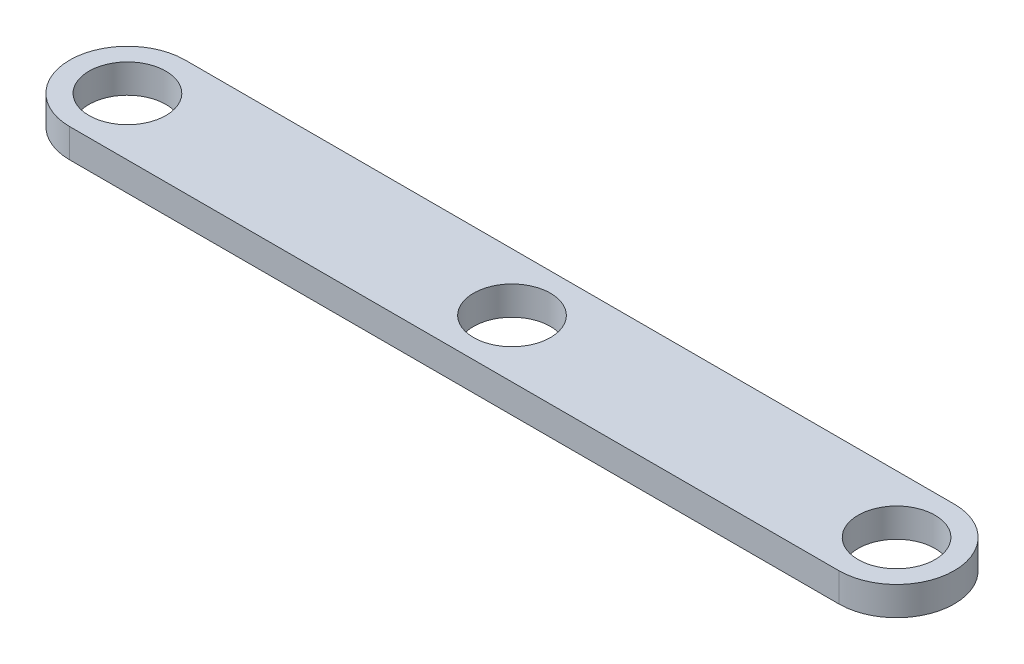
ISO-10303-21;
HEADER;
FILE_DESCRIPTION(('STEP AP214'),'2;1');
FILE_NAME('part.step','',(''),(''),'','','');
FILE_SCHEMA(('AUTOMOTIVE_DESIGN { 1 0 10303 214 1 1 1 1 }'));
ENDSEC;
DATA;
#1=APPLICATION_CONTEXT('core data for automotive mechanical design processes');
#2=APPLICATION_PROTOCOL_DEFINITION('international standard','automotive_design',2000,#1);
#3=PRODUCT_CONTEXT('',#1,'mechanical');
#4=PRODUCT('Part','Part','',(#3));
#5=PRODUCT_RELATED_PRODUCT_CATEGORY('part','',(#4));
#6=PRODUCT_DEFINITION_FORMATION('','',#4);
#7=PRODUCT_DEFINITION_CONTEXT('part definition',#1,'design');
#8=PRODUCT_DEFINITION('design','',#6,#7);
#9=PRODUCT_DEFINITION_SHAPE('','',#8);
#10=(LENGTH_UNIT() NAMED_UNIT(*) SI_UNIT(.MILLI.,.METRE.));
#11=(NAMED_UNIT(*) PLANE_ANGLE_UNIT() SI_UNIT($,.RADIAN.));
#12=(NAMED_UNIT(*) SI_UNIT($,.STERADIAN.) SOLID_ANGLE_UNIT());
#13=UNCERTAINTY_MEASURE_WITH_UNIT(LENGTH_MEASURE(1.E-05),#10,'distance_accuracy_value','');
#14=(GEOMETRIC_REPRESENTATION_CONTEXT(3) GLOBAL_UNCERTAINTY_ASSIGNED_CONTEXT((#13)) GLOBAL_UNIT_ASSIGNED_CONTEXT((#10,
#11,#12)) REPRESENTATION_CONTEXT('',''));
#15=CARTESIAN_POINT('',(0.,0.,0.));
#16=DIRECTION('',(0.,0.,1.));
#17=DIRECTION('',(1.,0.,0.));
#18=AXIS2_PLACEMENT_3D('',#15,#16,#17);
#19=CARTESIAN_POINT('',(0.,3.,0.));
#20=DIRECTION('',(0.,1.,0.));
#21=DIRECTION('',(0.,0.,1.));
#22=AXIS2_PLACEMENT_3D('',#19,#20,#21);
#23=PLANE('',#22);
#24=CARTESIAN_POINT('',(40.,3.,0.));
#25=DIRECTION('',(0.,1.,0.));
#26=DIRECTION('',(0.,0.,1.));
#27=AXIS2_PLACEMENT_3D('',#24,#25,#26);
#28=CIRCLE('',#27,4.);
#29=CARTESIAN_POINT('',(40.,3.,4.));
#30=VERTEX_POINT('',#29);
#31=EDGE_CURVE('E124',#30,#30,#28,.T.);
#32=ORIENTED_EDGE('',*,*,#31,.F.);
#33=EDGE_LOOP('',(#32));
#34=FACE_BOUND('',#33,.T.);
#35=CARTESIAN_POINT('',(0.,3.,0.));
#36=DIRECTION('',(0.,1.,0.));
#37=DIRECTION('',(0.,0.,1.));
#38=AXIS2_PLACEMENT_3D('',#35,#36,#37);
#39=CIRCLE('',#38,4.);
#40=CARTESIAN_POINT('',(0.,3.,4.));
#41=VERTEX_POINT('',#40);
#42=EDGE_CURVE('E100',#41,#41,#39,.T.);
#43=ORIENTED_EDGE('',*,*,#42,.F.);
#44=EDGE_LOOP('',(#43));
#45=FACE_BOUND('',#44,.T.);
#46=CARTESIAN_POINT('',(0.,3.,0.));
#47=DIRECTION('',(0.,1.,0.));
#48=DIRECTION('',(0.,0.,1.));
#49=AXIS2_PLACEMENT_3D('',#46,#47,#48);
#50=CIRCLE('',#49,6.);
#51=CARTESIAN_POINT('',(0.,3.,-6.));
#52=VERTEX_POINT('',#51);
#53=CARTESIAN_POINT('',(0.,3.,6.));
#54=VERTEX_POINT('',#53);
#55=EDGE_CURVE('E85',#52,#54,#50,.T.);
#56=ORIENTED_EDGE('',*,*,#55,.T.);
#57=DIRECTION('',(1.,0.,0.));
#58=VECTOR('',#57,1.);
#59=CARTESIAN_POINT('',(0.,3.,6.));
#60=LINE('',#59,#58);
#61=CARTESIAN_POINT('',(80.,3.,6.00000000000001));
#62=VERTEX_POINT('',#61);
#63=EDGE_CURVE('E80',#54,#62,#60,.T.);
#64=ORIENTED_EDGE('',*,*,#63,.T.);
#65=CARTESIAN_POINT('',(80.,3.,0.));
#66=DIRECTION('',(0.,1.,0.));
#67=DIRECTION('',(0.,0.,1.));
#68=AXIS2_PLACEMENT_3D('',#65,#66,#67);
#69=CIRCLE('',#68,6.00000000000001);
#70=CARTESIAN_POINT('',(80.,3.,-6.00000000000001));
#71=VERTEX_POINT('',#70);
#72=EDGE_CURVE('E83',#62,#71,#69,.T.);
#73=ORIENTED_EDGE('',*,*,#72,.T.);
#74=DIRECTION('',(-1.,0.,0.));
#75=VECTOR('',#74,1.);
#76=CARTESIAN_POINT('',(0.,3.,-6.));
#77=LINE('',#76,#75);
#78=EDGE_CURVE('E50',#71,#52,#77,.T.);
#79=ORIENTED_EDGE('',*,*,#78,.T.);
#80=EDGE_LOOP('',(#56,#64,#73,#79));
#81=FACE_BOUND('',#80,.T.);
#82=CARTESIAN_POINT('',(80.,3.,0.));
#83=DIRECTION('',(0.,1.,0.));
#84=DIRECTION('',(0.,0.,1.));
#85=AXIS2_PLACEMENT_3D('',#82,#83,#84);
#86=CIRCLE('',#85,4.00000000000001);
#87=CARTESIAN_POINT('',(80.,3.,4.00000000000001));
#88=VERTEX_POINT('',#87);
#89=EDGE_CURVE('E115',#88,#88,#86,.T.);
#90=ORIENTED_EDGE('',*,*,#89,.F.);
#91=EDGE_LOOP('',(#90));
#92=FACE_BOUND('',#91,.T.);
#93=ADVANCED_FACE('F33',(#34,#45,#81,#92),#23,.T.);
#94=CARTESIAN_POINT('',(0.,0.,0.));
#95=DIRECTION('',(0.,1.,0.));
#96=DIRECTION('',(0.,0.,1.));
#97=AXIS2_PLACEMENT_3D('',#94,#95,#96);
#98=PLANE('',#97);
#99=CARTESIAN_POINT('',(40.,0.,0.));
#100=DIRECTION('',(0.,1.,0.));
#101=DIRECTION('',(0.,0.,1.));
#102=AXIS2_PLACEMENT_3D('',#99,#100,#101);
#103=CIRCLE('',#102,4.);
#104=CARTESIAN_POINT('',(40.,0.,4.));
#105=VERTEX_POINT('',#104);
#106=EDGE_CURVE('E121',#105,#105,#103,.T.);
#107=ORIENTED_EDGE('',*,*,#106,.T.);
#108=EDGE_LOOP('',(#107));
#109=FACE_BOUND('',#108,.T.);
#110=CARTESIAN_POINT('',(0.,0.,0.));
#111=DIRECTION('',(0.,1.,0.));
#112=DIRECTION('',(0.,0.,1.));
#113=AXIS2_PLACEMENT_3D('',#110,#111,#112);
#114=CIRCLE('',#113,6.);
#115=CARTESIAN_POINT('',(0.,0.,-6.));
#116=VERTEX_POINT('',#115);
#117=CARTESIAN_POINT('',(0.,0.,6.));
#118=VERTEX_POINT('',#117);
#119=EDGE_CURVE('E97',#116,#118,#114,.T.);
#120=ORIENTED_EDGE('',*,*,#119,.F.);
#121=DIRECTION('',(-1.,0.,0.));
#122=VECTOR('',#121,1.);
#123=CARTESIAN_POINT('',(0.,0.,-6.));
#124=LINE('',#123,#122);
#125=CARTESIAN_POINT('',(80.,0.,-6.00000000000001));
#126=VERTEX_POINT('',#125);
#127=EDGE_CURVE('E73',#126,#116,#124,.T.);
#128=ORIENTED_EDGE('',*,*,#127,.F.);
#129=CARTESIAN_POINT('',(80.,0.,0.));
#130=DIRECTION('',(0.,1.,0.));
#131=DIRECTION('',(0.,0.,1.));
#132=AXIS2_PLACEMENT_3D('',#129,#130,#131);
#133=CIRCLE('',#132,6.00000000000001);
#134=CARTESIAN_POINT('',(80.,0.,6.00000000000001));
#135=VERTEX_POINT('',#134);
#136=EDGE_CURVE('E67',#135,#126,#133,.T.);
#137=ORIENTED_EDGE('',*,*,#136,.F.);
#138=DIRECTION('',(1.,0.,0.));
#139=VECTOR('',#138,1.);
#140=CARTESIAN_POINT('',(0.,0.,6.));
#141=LINE('',#140,#139);
#142=EDGE_CURVE('E89',#118,#135,#141,.T.);
#143=ORIENTED_EDGE('',*,*,#142,.F.);
#144=EDGE_LOOP('',(#120,#128,#137,#143));
#145=FACE_BOUND('',#144,.T.);
#146=CARTESIAN_POINT('',(0.,0.,0.));
#147=DIRECTION('',(0.,1.,0.));
#148=DIRECTION('',(0.,0.,1.));
#149=AXIS2_PLACEMENT_3D('',#146,#147,#148);
#150=CIRCLE('',#149,4.);
#151=CARTESIAN_POINT('',(0.,0.,4.));
#152=VERTEX_POINT('',#151);
#153=EDGE_CURVE('E112',#152,#152,#150,.T.);
#154=ORIENTED_EDGE('',*,*,#153,.T.);
#155=EDGE_LOOP('',(#154));
#156=FACE_BOUND('',#155,.T.);
#157=CARTESIAN_POINT('',(80.,0.,0.));
#158=DIRECTION('',(0.,1.,0.));
#159=DIRECTION('',(0.,0.,1.));
#160=AXIS2_PLACEMENT_3D('',#157,#158,#159);
#161=CIRCLE('',#160,4.00000000000001);
#162=CARTESIAN_POINT('',(80.,0.,4.00000000000001));
#163=VERTEX_POINT('',#162);
#164=EDGE_CURVE('E118',#163,#163,#161,.T.);
#165=ORIENTED_EDGE('',*,*,#164,.T.);
#166=EDGE_LOOP('',(#165));
#167=FACE_BOUND('',#166,.T.);
#168=ADVANCED_FACE('F108',(#109,#145,#156,#167),#98,.F.);
#169=CARTESIAN_POINT('',(0.,3.,0.));
#170=DIRECTION('',(0.,-1.,0.));
#171=DIRECTION('',(0.,0.,-1.));
#172=AXIS2_PLACEMENT_3D('',#169,#170,#171);
#173=CYLINDRICAL_SURFACE('',#172,6.);
#174=ORIENTED_EDGE('',*,*,#119,.T.);
#175=DIRECTION('',(0.,-1.,0.));
#176=VECTOR('',#175,1.);
#177=CARTESIAN_POINT('',(0.,3.,6.));
#178=LINE('',#177,#176);
#179=EDGE_CURVE('E11',#54,#118,#178,.T.);
#180=ORIENTED_EDGE('',*,*,#179,.F.);
#181=ORIENTED_EDGE('',*,*,#55,.F.);
#182=DIRECTION('',(0.,-1.,0.));
#183=VECTOR('',#182,1.);
#184=CARTESIAN_POINT('',(0.,3.,-6.));
#185=LINE('',#184,#183);
#186=EDGE_CURVE('E93',#52,#116,#185,.T.);
#187=ORIENTED_EDGE('',*,*,#186,.T.);
#188=EDGE_LOOP('',(#174,#180,#181,#187));
#189=FACE_BOUND('',#188,.T.);
#190=ADVANCED_FACE('F35',(#189),#173,.T.);
#191=CARTESIAN_POINT('',(0.,3.,6.));
#192=DIRECTION('',(0.,0.,-1.));
#193=DIRECTION('',(-1.,0.,0.));
#194=AXIS2_PLACEMENT_3D('',#191,#192,#193);
#195=PLANE('',#194);
#196=ORIENTED_EDGE('',*,*,#142,.T.);
#197=DIRECTION('',(0.,-1.,0.));
#198=VECTOR('',#197,1.);
#199=CARTESIAN_POINT('',(80.,3.,6.00000000000001));
#200=LINE('',#199,#198);
#201=EDGE_CURVE('E42',#62,#135,#200,.T.);
#202=ORIENTED_EDGE('',*,*,#201,.F.);
#203=ORIENTED_EDGE('',*,*,#63,.F.);
#204=ORIENTED_EDGE('',*,*,#179,.T.);
#205=EDGE_LOOP('',(#196,#202,#203,#204));
#206=FACE_BOUND('',#205,.T.);
#207=ADVANCED_FACE('F88',(#206),#195,.F.);
#208=CARTESIAN_POINT('',(80.,3.,0.));
#209=DIRECTION('',(0.,-1.,0.));
#210=DIRECTION('',(0.,0.,-1.));
#211=AXIS2_PLACEMENT_3D('',#208,#209,#210);
#212=CYLINDRICAL_SURFACE('',#211,6.00000000000001);
#213=ORIENTED_EDGE('',*,*,#136,.T.);
#214=DIRECTION('',(0.,-1.,0.));
#215=VECTOR('',#214,1.);
#216=CARTESIAN_POINT('',(80.,3.,-6.00000000000001));
#217=LINE('',#216,#215);
#218=EDGE_CURVE('E90',#71,#126,#217,.T.);
#219=ORIENTED_EDGE('',*,*,#218,.F.);
#220=ORIENTED_EDGE('',*,*,#72,.F.);
#221=ORIENTED_EDGE('',*,*,#201,.T.);
#222=EDGE_LOOP('',(#213,#219,#220,#221));
#223=FACE_BOUND('',#222,.T.);
#224=ADVANCED_FACE('F91',(#223),#212,.T.);
#225=CARTESIAN_POINT('',(0.,3.,-6.));
#226=DIRECTION('',(0.,0.,1.));
#227=DIRECTION('',(1.,0.,0.));
#228=AXIS2_PLACEMENT_3D('',#225,#226,#227);
#229=PLANE('',#228);
#230=ORIENTED_EDGE('',*,*,#127,.T.);
#231=ORIENTED_EDGE('',*,*,#186,.F.);
#232=ORIENTED_EDGE('',*,*,#78,.F.);
#233=ORIENTED_EDGE('',*,*,#218,.T.);
#234=EDGE_LOOP('',(#230,#231,#232,#233));
#235=FACE_BOUND('',#234,.T.);
#236=ADVANCED_FACE('F105',(#235),#229,.F.);
#237=CARTESIAN_POINT('',(0.,3.,0.));
#238=DIRECTION('',(0.,-1.,0.));
#239=DIRECTION('',(0.,0.,-1.));
#240=AXIS2_PLACEMENT_3D('',#237,#238,#239);
#241=CYLINDRICAL_SURFACE('',#240,4.);
#242=ORIENTED_EDGE('',*,*,#42,.T.);
#243=EDGE_LOOP('',(#242));
#244=FACE_BOUND('',#243,.T.);
#245=ORIENTED_EDGE('',*,*,#153,.F.);
#246=EDGE_LOOP('',(#245));
#247=FACE_BOUND('',#246,.T.);
#248=ADVANCED_FACE('F143',(#244,#247),#241,.F.);
#249=CARTESIAN_POINT('',(80.,3.,0.));
#250=DIRECTION('',(0.,-1.,0.));
#251=DIRECTION('',(0.,0.,-1.));
#252=AXIS2_PLACEMENT_3D('',#249,#250,#251);
#253=CYLINDRICAL_SURFACE('',#252,4.00000000000001);
#254=ORIENTED_EDGE('',*,*,#89,.T.);
#255=EDGE_LOOP('',(#254));
#256=FACE_BOUND('',#255,.T.);
#257=ORIENTED_EDGE('',*,*,#164,.F.);
#258=EDGE_LOOP('',(#257));
#259=FACE_BOUND('',#258,.T.);
#260=ADVANCED_FACE('F134',(#256,#259),#253,.F.);
#261=CARTESIAN_POINT('',(40.,0.,0.));
#262=DIRECTION('',(0.,1.,0.));
#263=DIRECTION('',(0.,0.,1.));
#264=AXIS2_PLACEMENT_3D('',#261,#262,#263);
#265=CYLINDRICAL_SURFACE('',#264,4.);
#266=ORIENTED_EDGE('',*,*,#106,.F.);
#267=EDGE_LOOP('',(#266));
#268=FACE_BOUND('',#267,.T.);
#269=ORIENTED_EDGE('',*,*,#31,.T.);
#270=EDGE_LOOP('',(#269));
#271=FACE_BOUND('',#270,.T.);
#272=ADVANCED_FACE('F131',(#268,#271),#265,.F.);
#273=CLOSED_SHELL('',(#93,#168,#190,#207,#224,#236,#248,#260,#272));
#274=MANIFOLD_SOLID_BREP('B2',#273);
#275=ADVANCED_BREP_SHAPE_REPRESENTATION('',(#18,#274),#14);
#276=SHAPE_DEFINITION_REPRESENTATION(#9,#275);
ENDSEC;
END-ISO-10303-21;
